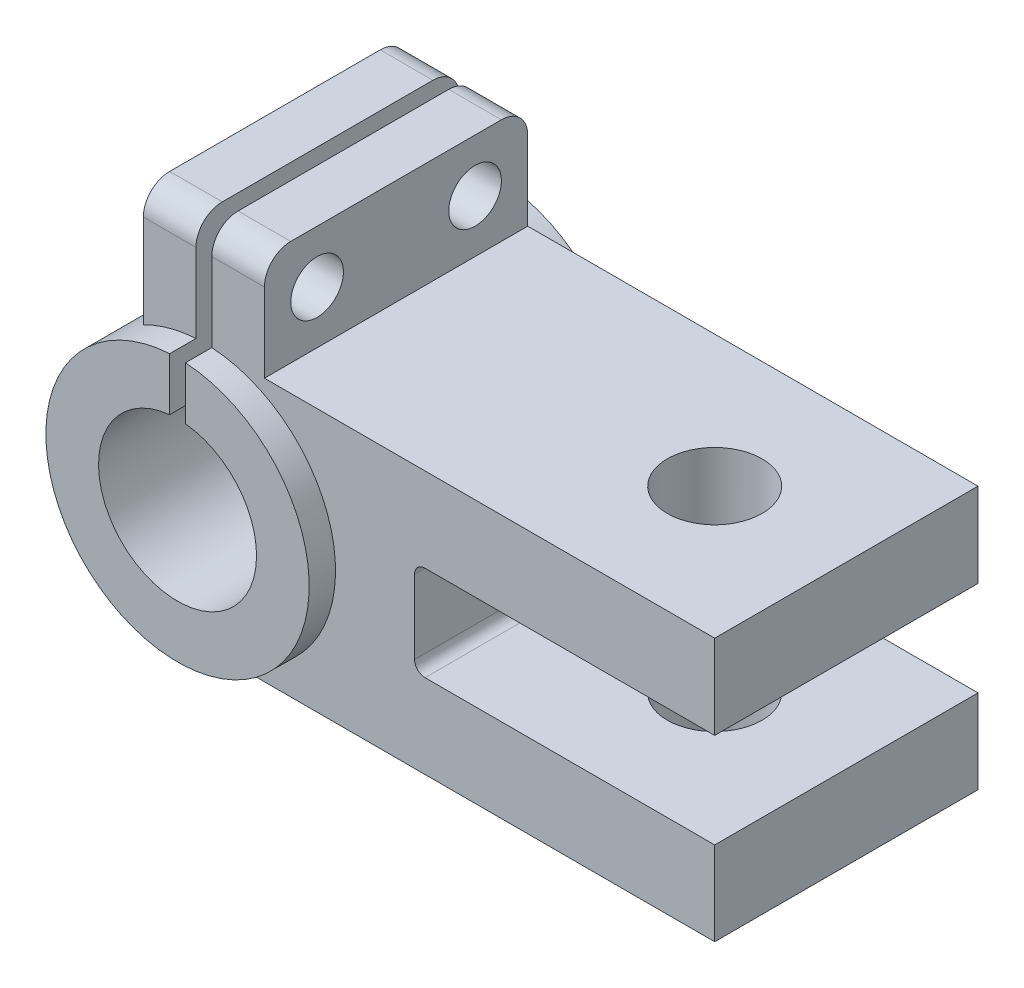
ISO-10303-21;
HEADER;
FILE_DESCRIPTION(('STEP AP214'),'2;1');
FILE_NAME('part.step','',(''),(''),'','','');
FILE_SCHEMA(('AUTOMOTIVE_DESIGN { 1 0 10303 214 1 1 1 1 }'));
ENDSEC;
DATA;
#1=APPLICATION_CONTEXT('core data for automotive mechanical design processes');
#2=APPLICATION_PROTOCOL_DEFINITION('international standard','automotive_design',2000,#1);
#3=PRODUCT_CONTEXT('',#1,'mechanical');
#4=PRODUCT('Part','Part','',(#3));
#5=PRODUCT_RELATED_PRODUCT_CATEGORY('part','',(#4));
#6=PRODUCT_DEFINITION_FORMATION('','',#4);
#7=PRODUCT_DEFINITION_CONTEXT('part definition',#1,'design');
#8=PRODUCT_DEFINITION('design','',#6,#7);
#9=PRODUCT_DEFINITION_SHAPE('','',#8);
#10=(LENGTH_UNIT() NAMED_UNIT(*) SI_UNIT(.MILLI.,.METRE.));
#11=(NAMED_UNIT(*) PLANE_ANGLE_UNIT() SI_UNIT($,.RADIAN.));
#12=(NAMED_UNIT(*) SI_UNIT($,.STERADIAN.) SOLID_ANGLE_UNIT());
#13=UNCERTAINTY_MEASURE_WITH_UNIT(LENGTH_MEASURE(1.E-05),#10,'distance_accuracy_value','');
#14=(GEOMETRIC_REPRESENTATION_CONTEXT(3) GLOBAL_UNCERTAINTY_ASSIGNED_CONTEXT((#13)) GLOBAL_UNIT_ASSIGNED_CONTEXT((#10,
#11,#12)) REPRESENTATION_CONTEXT('',''));
#15=CARTESIAN_POINT('',(0.,0.,0.));
#16=DIRECTION('',(0.,0.,1.));
#17=DIRECTION('',(1.,0.,0.));
#18=AXIS2_PLACEMENT_3D('',#15,#16,#17);
#19=CARTESIAN_POINT('',(0.,0.,30.));
#20=DIRECTION('',(0.,0.,-1.));
#21=DIRECTION('',(-1.,0.,0.));
#22=AXIS2_PLACEMENT_3D('',#19,#20,#21);
#23=CYLINDRICAL_SURFACE('',#22,15.);
#24=CARTESIAN_POINT('',(0.,0.,-30.));
#25=DIRECTION('',(0.,0.,1.));
#26=DIRECTION('',(1.,0.,0.));
#27=AXIS2_PLACEMENT_3D('',#24,#25,#26);
#28=CIRCLE('',#27,15.);
#29=CARTESIAN_POINT('',(-1.5,14.9248115565993,-30.));
#30=VERTEX_POINT('',#29);
#31=CARTESIAN_POINT('',(1.5,14.9248115565993,-30.));
#32=VERTEX_POINT('',#31);
#33=EDGE_CURVE('E358',#30,#32,#28,.T.);
#34=ORIENTED_EDGE('',*,*,#33,.F.);
#35=DIRECTION('',(0.,0.,-1.));
#36=VECTOR('',#35,1.);
#37=CARTESIAN_POINT('',(-1.5,14.9248115565993,30.));
#38=LINE('',#37,#36);
#39=CARTESIAN_POINT('',(-1.5,14.9248115565993,30.));
#40=VERTEX_POINT('',#39);
#41=EDGE_CURVE('E400',#40,#30,#38,.T.);
#42=ORIENTED_EDGE('',*,*,#41,.F.);
#43=CARTESIAN_POINT('',(0.,0.,30.));
#44=DIRECTION('',(0.,0.,1.));
#45=DIRECTION('',(1.,0.,0.));
#46=AXIS2_PLACEMENT_3D('',#43,#44,#45);
#47=CIRCLE('',#46,15.);
#48=CARTESIAN_POINT('',(1.5,14.9248115565993,30.));
#49=VERTEX_POINT('',#48);
#50=EDGE_CURVE('E359',#40,#49,#47,.T.);
#51=ORIENTED_EDGE('',*,*,#50,.T.);
#52=DIRECTION('',(0.,0.,-1.));
#53=VECTOR('',#52,1.);
#54=CARTESIAN_POINT('',(1.5,14.9248115565993,30.));
#55=LINE('',#54,#53);
#56=EDGE_CURVE('E374',#49,#32,#55,.T.);
#57=ORIENTED_EDGE('',*,*,#56,.T.);
#58=EDGE_LOOP('',(#34,#42,#51,#57));
#59=FACE_BOUND('',#58,.T.);
#60=ADVANCED_FACE('F43',(#59),#23,.F.);
#61=CARTESIAN_POINT('',(-1.5,0.,30.));
#62=DIRECTION('',(1.,0.,0.));
#63=DIRECTION('',(0.,1.,0.));
#64=AXIS2_PLACEMENT_3D('',#61,#62,#63);
#65=PLANE('',#64);
#66=CARTESIAN_POINT('',(-1.5,34.9248115565993,-15.));
#67=DIRECTION('',(1.,0.,0.));
#68=DIRECTION('',(0.,1.,0.));
#69=AXIS2_PLACEMENT_3D('',#66,#67,#68);
#70=CIRCLE('',#69,4.99999999999999);
#71=CARTESIAN_POINT('',(-1.5,39.9248115565993,-15.));
#72=VERTEX_POINT('',#71);
#73=EDGE_CURVE('E557',#72,#72,#70,.T.);
#74=ORIENTED_EDGE('',*,*,#73,.F.);
#75=EDGE_LOOP('',(#74));
#76=FACE_BOUND('',#75,.T.);
#77=CARTESIAN_POINT('',(-1.5,34.9248115565993,15.));
#78=DIRECTION('',(1.,0.,0.));
#79=DIRECTION('',(0.,1.,0.));
#80=AXIS2_PLACEMENT_3D('',#77,#78,#79);
#81=CIRCLE('',#80,4.99999999999999);
#82=CARTESIAN_POINT('',(-1.5,39.9248115565993,15.));
#83=VERTEX_POINT('',#82);
#84=EDGE_CURVE('E545',#83,#83,#81,.T.);
#85=ORIENTED_EDGE('',*,*,#84,.F.);
#86=EDGE_LOOP('',(#85));
#87=FACE_BOUND('',#86,.T.);
#88=DIRECTION('',(0.,0.,-1.));
#89=VECTOR('',#88,1.);
#90=CARTESIAN_POINT('',(-1.5,44.9248115565993,25.));
#91=LINE('',#90,#89);
#92=CARTESIAN_POINT('',(-1.5,44.9248115565993,20.));
#93=VERTEX_POINT('',#92);
#94=CARTESIAN_POINT('',(-1.5,44.9248115565993,-20.));
#95=VERTEX_POINT('',#94);
#96=EDGE_CURVE('E252',#93,#95,#91,.T.);
#97=ORIENTED_EDGE('',*,*,#96,.F.);
#98=CARTESIAN_POINT('',(-1.5,39.9248115565993,20.));
#99=DIRECTION('',(1.,0.,0.));
#100=DIRECTION('',(0.,1.,0.));
#101=AXIS2_PLACEMENT_3D('',#98,#99,#100);
#102=CIRCLE('',#101,5.);
#103=CARTESIAN_POINT('',(-1.5,39.9248115565993,25.));
#104=VERTEX_POINT('',#103);
#105=EDGE_CURVE('E419',#93,#104,#102,.T.);
#106=ORIENTED_EDGE('',*,*,#105,.T.);
#107=DIRECTION('',(0.,-1.,0.));
#108=VECTOR('',#107,1.);
#109=CARTESIAN_POINT('',(-1.5,0.,25.));
#110=LINE('',#109,#108);
#111=CARTESIAN_POINT('',(-1.5,24.9549594269356,25.));
#112=VERTEX_POINT('',#111);
#113=EDGE_CURVE('E246',#104,#112,#110,.T.);
#114=ORIENTED_EDGE('',*,*,#113,.T.);
#115=DIRECTION('',(0.,0.,-1.));
#116=VECTOR('',#115,1.);
#117=CARTESIAN_POINT('',(-1.5,24.9549594269356,30.));
#118=LINE('',#117,#116);
#119=CARTESIAN_POINT('',(-1.5,24.9549594269356,30.));
#120=VERTEX_POINT('',#119);
#121=EDGE_CURVE('E397',#120,#112,#118,.T.);
#122=ORIENTED_EDGE('',*,*,#121,.F.);
#123=DIRECTION('',(0.,-1.,0.));
#124=VECTOR('',#123,1.);
#125=CARTESIAN_POINT('',(-1.5,0.,30.));
#126=LINE('',#125,#124);
#127=EDGE_CURVE('E363',#120,#40,#126,.T.);
#128=ORIENTED_EDGE('',*,*,#127,.T.);
#129=ORIENTED_EDGE('',*,*,#41,.T.);
#130=DIRECTION('',(0.,-1.,0.));
#131=VECTOR('',#130,1.);
#132=CARTESIAN_POINT('',(-1.5,0.,-30.));
#133=LINE('',#132,#131);
#134=CARTESIAN_POINT('',(-1.5,24.9549594269356,-30.));
#135=VERTEX_POINT('',#134);
#136=EDGE_CURVE('E378',#135,#30,#133,.T.);
#137=ORIENTED_EDGE('',*,*,#136,.F.);
#138=CARTESIAN_POINT('',(-1.5,24.9549594269356,-25.));
#139=VERTEX_POINT('',#138);
#140=EDGE_CURVE('E396',#139,#135,#118,.T.);
#141=ORIENTED_EDGE('',*,*,#140,.F.);
#142=DIRECTION('',(0.,-1.,0.));
#143=VECTOR('',#142,1.);
#144=CARTESIAN_POINT('',(-1.5,0.,-25.));
#145=LINE('',#144,#143);
#146=CARTESIAN_POINT('',(-1.5,39.9248115565993,-25.));
#147=VERTEX_POINT('',#146);
#148=EDGE_CURVE('E234',#147,#139,#145,.T.);
#149=ORIENTED_EDGE('',*,*,#148,.F.);
#150=CARTESIAN_POINT('',(-1.5,39.9248115565993,-20.));
#151=DIRECTION('',(1.,0.,0.));
#152=DIRECTION('',(0.,1.,0.));
#153=AXIS2_PLACEMENT_3D('',#150,#151,#152);
#154=CIRCLE('',#153,5.);
#155=EDGE_CURVE('E416',#147,#95,#154,.T.);
#156=ORIENTED_EDGE('',*,*,#155,.T.);
#157=EDGE_LOOP('',(#97,#106,#114,#122,#128,#129,#137,#141,#149,#156));
#158=FACE_BOUND('',#157,.T.);
#159=ADVANCED_FACE('F599',(#76,#87,#158),#65,.T.);
#160=CARTESIAN_POINT('',(0.,0.,30.));
#161=DIRECTION('',(0.,0.,-1.));
#162=DIRECTION('',(-1.,0.,0.));
#163=AXIS2_PLACEMENT_3D('',#160,#161,#162);
#164=CYLINDRICAL_SURFACE('',#163,25.);
#165=ORIENTED_EDGE('',*,*,#121,.T.);
#166=CARTESIAN_POINT('',(0.,0.,25.));
#167=DIRECTION('',(0.,0.,1.));
#168=DIRECTION('',(1.,0.,0.));
#169=AXIS2_PLACEMENT_3D('',#166,#167,#168);
#170=CIRCLE('',#169,25.);
#171=CARTESIAN_POINT('',(-11.5,22.1979728804231,25.));
#172=VERTEX_POINT('',#171);
#173=EDGE_CURVE('E218',#112,#172,#170,.T.);
#174=ORIENTED_EDGE('',*,*,#173,.T.);
#175=DIRECTION('',(0.,0.,-1.));
#176=VECTOR('',#175,1.);
#177=CARTESIAN_POINT('',(-11.5,22.1979728804231,25.));
#178=LINE('',#177,#176);
#179=CARTESIAN_POINT('',(-11.5,22.1979728804231,-25.));
#180=VERTEX_POINT('',#179);
#181=EDGE_CURVE('E211',#172,#180,#178,.T.);
#182=ORIENTED_EDGE('',*,*,#181,.T.);
#183=CARTESIAN_POINT('',(0.,0.,-25.));
#184=DIRECTION('',(0.,0.,1.));
#185=DIRECTION('',(1.,0.,0.));
#186=AXIS2_PLACEMENT_3D('',#183,#184,#185);
#187=CIRCLE('',#186,25.);
#188=EDGE_CURVE('E215',#139,#180,#187,.T.);
#189=ORIENTED_EDGE('',*,*,#188,.F.);
#190=ORIENTED_EDGE('',*,*,#140,.T.);
#191=CARTESIAN_POINT('',(0.,0.,-30.));
#192=DIRECTION('',(0.,0.,1.));
#193=DIRECTION('',(1.,0.,0.));
#194=AXIS2_PLACEMENT_3D('',#191,#192,#193);
#195=CIRCLE('',#194,25.);
#196=CARTESIAN_POINT('',(1.5,24.9549594269356,-30.));
#197=VERTEX_POINT('',#196);
#198=EDGE_CURVE('E382',#135,#197,#195,.T.);
#199=ORIENTED_EDGE('',*,*,#198,.T.);
#200=DIRECTION('',(0.,0.,-1.));
#201=VECTOR('',#200,1.);
#202=CARTESIAN_POINT('',(1.5,24.9549594269356,30.));
#203=LINE('',#202,#201);
#204=CARTESIAN_POINT('',(1.5,24.9549594269356,-25.));
#205=VERTEX_POINT('',#204);
#206=EDGE_CURVE('E391',#205,#197,#203,.T.);
#207=ORIENTED_EDGE('',*,*,#206,.F.);
#208=CARTESIAN_POINT('',(0.,0.,-25.));
#209=DIRECTION('',(0.,0.,1.));
#210=DIRECTION('',(1.,0.,0.));
#211=AXIS2_PLACEMENT_3D('',#208,#209,#210);
#212=CIRCLE('',#211,25.);
#213=CARTESIAN_POINT('',(0.,-25.,-25.));
#214=VERTEX_POINT('',#213);
#215=EDGE_CURVE('E256',#214,#205,#212,.T.);
#216=ORIENTED_EDGE('',*,*,#215,.F.);
#217=DIRECTION('',(0.,0.,-1.));
#218=VECTOR('',#217,1.);
#219=CARTESIAN_POINT('',(0.,-25.,25.));
#220=LINE('',#219,#218);
#221=CARTESIAN_POINT('',(0.,-25.,25.));
#222=VERTEX_POINT('',#221);
#223=EDGE_CURVE('E355',#222,#214,#220,.T.);
#224=ORIENTED_EDGE('',*,*,#223,.F.);
#225=CARTESIAN_POINT('',(0.,0.,25.));
#226=DIRECTION('',(0.,0.,1.));
#227=DIRECTION('',(1.,0.,0.));
#228=AXIS2_PLACEMENT_3D('',#225,#226,#227);
#229=CIRCLE('',#228,25.);
#230=CARTESIAN_POINT('',(1.5,24.9549594269356,25.));
#231=VERTEX_POINT('',#230);
#232=EDGE_CURVE('E257',#222,#231,#229,.T.);
#233=ORIENTED_EDGE('',*,*,#232,.T.);
#234=CARTESIAN_POINT('',(1.5,24.9549594269356,30.));
#235=VERTEX_POINT('',#234);
#236=EDGE_CURVE('E392',#235,#231,#203,.T.);
#237=ORIENTED_EDGE('',*,*,#236,.F.);
#238=CARTESIAN_POINT('',(0.,0.,30.));
#239=DIRECTION('',(0.,0.,1.));
#240=DIRECTION('',(1.,0.,0.));
#241=AXIS2_PLACEMENT_3D('',#238,#239,#240);
#242=CIRCLE('',#241,25.);
#243=EDGE_CURVE('E368',#120,#235,#242,.T.);
#244=ORIENTED_EDGE('',*,*,#243,.F.);
#245=EDGE_LOOP('',(#165,#174,#182,#189,#190,#199,#207,#216,#224,#233,#237,#244));
#246=FACE_BOUND('',#245,.T.);
#247=ADVANCED_FACE('F214',(#246),#164,.T.);
#248=CARTESIAN_POINT('',(1.5,0.,30.));
#249=DIRECTION('',(1.,0.,0.));
#250=DIRECTION('',(0.,1.,0.));
#251=AXIS2_PLACEMENT_3D('',#248,#249,#250);
#252=PLANE('',#251);
#253=CARTESIAN_POINT('',(1.5,34.9248115565993,-15.));
#254=DIRECTION('',(1.,0.,0.));
#255=DIRECTION('',(0.,1.,0.));
#256=AXIS2_PLACEMENT_3D('',#253,#254,#255);
#257=CIRCLE('',#256,4.99999999999999);
#258=CARTESIAN_POINT('',(1.5,39.9248115565993,-15.));
#259=VERTEX_POINT('',#258);
#260=EDGE_CURVE('E565',#259,#259,#257,.T.);
#261=ORIENTED_EDGE('',*,*,#260,.T.);
#262=EDGE_LOOP('',(#261));
#263=FACE_BOUND('',#262,.T.);
#264=CARTESIAN_POINT('',(1.5,34.9248115565993,15.));
#265=DIRECTION('',(1.,0.,0.));
#266=DIRECTION('',(0.,1.,0.));
#267=AXIS2_PLACEMENT_3D('',#264,#265,#266);
#268=CIRCLE('',#267,4.99999999999999);
#269=CARTESIAN_POINT('',(1.5,39.9248115565993,15.));
#270=VERTEX_POINT('',#269);
#271=EDGE_CURVE('E549',#270,#270,#268,.T.);
#272=ORIENTED_EDGE('',*,*,#271,.T.);
#273=EDGE_LOOP('',(#272));
#274=FACE_BOUND('',#273,.T.);
#275=DIRECTION('',(0.,-1.,0.));
#276=VECTOR('',#275,1.);
#277=CARTESIAN_POINT('',(1.5,0.,25.));
#278=LINE('',#277,#276);
#279=CARTESIAN_POINT('',(1.5,39.9248115565993,25.));
#280=VERTEX_POINT('',#279);
#281=EDGE_CURVE('E292',#280,#231,#278,.T.);
#282=ORIENTED_EDGE('',*,*,#281,.F.);
#283=CARTESIAN_POINT('',(1.5,39.9248115565993,20.));
#284=DIRECTION('',(1.,0.,0.));
#285=DIRECTION('',(0.,1.,0.));
#286=AXIS2_PLACEMENT_3D('',#283,#284,#285);
#287=CIRCLE('',#286,5.);
#288=CARTESIAN_POINT('',(1.5,44.9248115565993,20.));
#289=VERTEX_POINT('',#288);
#290=EDGE_CURVE('E437',#280,#289,#287,.F.);
#291=ORIENTED_EDGE('',*,*,#290,.T.);
#292=DIRECTION('',(0.,0.,-1.));
#293=VECTOR('',#292,1.);
#294=CARTESIAN_POINT('',(1.5,44.9248115565993,25.));
#295=LINE('',#294,#293);
#296=CARTESIAN_POINT('',(1.5,44.9248115565993,-20.));
#297=VERTEX_POINT('',#296);
#298=EDGE_CURVE('E295',#289,#297,#295,.T.);
#299=ORIENTED_EDGE('',*,*,#298,.T.);
#300=CARTESIAN_POINT('',(1.5,39.9248115565993,-20.));
#301=DIRECTION('',(1.,0.,0.));
#302=DIRECTION('',(0.,1.,0.));
#303=AXIS2_PLACEMENT_3D('',#300,#301,#302);
#304=CIRCLE('',#303,5.);
#305=CARTESIAN_POINT('',(1.5,39.9248115565993,-25.));
#306=VERTEX_POINT('',#305);
#307=EDGE_CURVE('E434',#297,#306,#304,.F.);
#308=ORIENTED_EDGE('',*,*,#307,.T.);
#309=DIRECTION('',(0.,-1.,0.));
#310=VECTOR('',#309,1.);
#311=CARTESIAN_POINT('',(1.5,0.,-25.));
#312=LINE('',#311,#310);
#313=EDGE_CURVE('E262',#306,#205,#312,.T.);
#314=ORIENTED_EDGE('',*,*,#313,.T.);
#315=ORIENTED_EDGE('',*,*,#206,.T.);
#316=DIRECTION('',(0.,-1.,0.));
#317=VECTOR('',#316,1.);
#318=CARTESIAN_POINT('',(1.5,0.,-30.));
#319=LINE('',#318,#317);
#320=EDGE_CURVE('E364',#197,#32,#319,.T.);
#321=ORIENTED_EDGE('',*,*,#320,.T.);
#322=ORIENTED_EDGE('',*,*,#56,.F.);
#323=DIRECTION('',(0.,-1.,0.));
#324=VECTOR('',#323,1.);
#325=CARTESIAN_POINT('',(1.5,0.,30.));
#326=LINE('',#325,#324);
#327=EDGE_CURVE('E371',#235,#49,#326,.T.);
#328=ORIENTED_EDGE('',*,*,#327,.F.);
#329=ORIENTED_EDGE('',*,*,#236,.T.);
#330=EDGE_LOOP('',(#282,#291,#299,#308,#314,#315,#321,#322,#328,#329));
#331=FACE_BOUND('',#330,.T.);
#332=ADVANCED_FACE('F507',(#263,#274,#331),#252,.F.);
#333=CARTESIAN_POINT('',(0.,0.,30.));
#334=DIRECTION('',(0.,0.,1.));
#335=DIRECTION('',(1.,0.,0.));
#336=AXIS2_PLACEMENT_3D('',#333,#334,#335);
#337=PLANE('',#336);
#338=ORIENTED_EDGE('',*,*,#50,.F.);
#339=ORIENTED_EDGE('',*,*,#127,.F.);
#340=ORIENTED_EDGE('',*,*,#243,.T.);
#341=ORIENTED_EDGE('',*,*,#327,.T.);
#342=EDGE_LOOP('',(#338,#339,#340,#341));
#343=FACE_BOUND('',#342,.T.);
#344=ADVANCED_FACE('F648',(#343),#337,.T.);
#345=CARTESIAN_POINT('',(0.,0.,-30.));
#346=DIRECTION('',(0.,0.,1.));
#347=DIRECTION('',(1.,0.,0.));
#348=AXIS2_PLACEMENT_3D('',#345,#346,#347);
#349=PLANE('',#348);
#350=ORIENTED_EDGE('',*,*,#33,.T.);
#351=ORIENTED_EDGE('',*,*,#320,.F.);
#352=ORIENTED_EDGE('',*,*,#198,.F.);
#353=ORIENTED_EDGE('',*,*,#136,.T.);
#354=EDGE_LOOP('',(#350,#351,#352,#353));
#355=FACE_BOUND('',#354,.T.);
#356=ADVANCED_FACE('F660',(#355),#349,.F.);
#357=CARTESIAN_POINT('',(0.,-25.,25.));
#358=DIRECTION('',(0.,-1.,0.));
#359=DIRECTION('',(1.,0.,0.));
#360=AXIS2_PLACEMENT_3D('',#357,#358,#359);
#361=PLANE('',#360);
#362=CARTESIAN_POINT('',(72.,-25.,0.));
#363=DIRECTION('',(0.,-1.,0.));
#364=DIRECTION('',(0.,0.,-1.));
#365=AXIS2_PLACEMENT_3D('',#362,#363,#364);
#366=CIRCLE('',#365,8.99999999999999);
#367=CARTESIAN_POINT('',(72.,-25.,-8.99999999999999));
#368=VERTEX_POINT('',#367);
#369=EDGE_CURVE('E409',#368,#368,#366,.T.);
#370=ORIENTED_EDGE('',*,*,#369,.F.);
#371=EDGE_LOOP('',(#370));
#372=FACE_BOUND('',#371,.T.);
#373=DIRECTION('',(-1.,0.,0.));
#374=VECTOR('',#373,1.);
#375=CARTESIAN_POINT('',(0.,-25.,-25.));
#376=LINE('',#375,#374);
#377=CARTESIAN_POINT('',(97.,-25.,-25.));
#378=VERTEX_POINT('',#377);
#379=EDGE_CURVE('E299',#378,#214,#376,.T.);
#380=ORIENTED_EDGE('',*,*,#379,.F.);
#381=DIRECTION('',(0.,0.,-1.));
#382=VECTOR('',#381,1.);
#383=CARTESIAN_POINT('',(97.,-25.,25.));
#384=LINE('',#383,#382);
#385=CARTESIAN_POINT('',(97.,-25.,25.));
#386=VERTEX_POINT('',#385);
#387=EDGE_CURVE('E352',#386,#378,#384,.T.);
#388=ORIENTED_EDGE('',*,*,#387,.F.);
#389=DIRECTION('',(-1.,0.,0.));
#390=VECTOR('',#389,1.);
#391=CARTESIAN_POINT('',(0.,-25.,25.));
#392=LINE('',#391,#390);
#393=EDGE_CURVE('E261',#386,#222,#392,.T.);
#394=ORIENTED_EDGE('',*,*,#393,.T.);
#395=ORIENTED_EDGE('',*,*,#223,.T.);
#396=EDGE_LOOP('',(#380,#388,#394,#395));
#397=FACE_BOUND('',#396,.T.);
#398=ADVANCED_FACE('F641',(#372,#397),#361,.T.);
#399=CARTESIAN_POINT('',(97.,0.,25.));
#400=DIRECTION('',(1.,0.,0.));
#401=DIRECTION('',(0.,0.,-1.));
#402=AXIS2_PLACEMENT_3D('',#399,#400,#401);
#403=PLANE('',#402);
#404=DIRECTION('',(0.,-1.,0.));
#405=VECTOR('',#404,1.);
#406=CARTESIAN_POINT('',(97.,0.,-25.));
#407=LINE('',#406,#405);
#408=CARTESIAN_POINT('',(97.,-9.07518844340071,-25.));
#409=VERTEX_POINT('',#408);
#410=EDGE_CURVE('E303',#409,#378,#407,.T.);
#411=ORIENTED_EDGE('',*,*,#410,.F.);
#412=DIRECTION('',(0.,0.,-1.));
#413=VECTOR('',#412,1.);
#414=CARTESIAN_POINT('',(97.,-9.07518844340071,25.));
#415=LINE('',#414,#413);
#416=CARTESIAN_POINT('',(97.,-9.07518844340071,25.));
#417=VERTEX_POINT('',#416);
#418=EDGE_CURVE('E348',#417,#409,#415,.T.);
#419=ORIENTED_EDGE('',*,*,#418,.F.);
#420=DIRECTION('',(0.,-1.,0.));
#421=VECTOR('',#420,1.);
#422=CARTESIAN_POINT('',(97.,0.,25.));
#423=LINE('',#422,#421);
#424=EDGE_CURVE('E266',#417,#386,#423,.T.);
#425=ORIENTED_EDGE('',*,*,#424,.T.);
#426=ORIENTED_EDGE('',*,*,#387,.T.);
#427=EDGE_LOOP('',(#411,#419,#425,#426));
#428=FACE_BOUND('',#427,.T.);
#429=ADVANCED_FACE('F639',(#428),#403,.T.);
#430=CARTESIAN_POINT('',(0.,-9.07518844340071,25.));
#431=DIRECTION('',(0.,1.,0.));
#432=DIRECTION('',(0.,0.,1.));
#433=AXIS2_PLACEMENT_3D('',#430,#431,#432);
#434=PLANE('',#433);
#435=CARTESIAN_POINT('',(72.,-9.07518844340071,0.));
#436=DIRECTION('',(0.,1.,0.));
#437=DIRECTION('',(0.,0.,1.));
#438=AXIS2_PLACEMENT_3D('',#435,#436,#437);
#439=CIRCLE('',#438,8.99999999999999);
#440=CARTESIAN_POINT('',(72.,-9.07518844340071,8.99999999999999));
#441=VERTEX_POINT('',#440);
#442=EDGE_CURVE('E236',#441,#441,#439,.T.);
#443=ORIENTED_EDGE('',*,*,#442,.F.);
#444=EDGE_LOOP('',(#443));
#445=FACE_BOUND('',#444,.T.);
#446=DIRECTION('',(1.,0.,0.));
#447=VECTOR('',#446,1.);
#448=CARTESIAN_POINT('',(0.,-9.07518844340071,-25.));
#449=LINE('',#448,#447);
#450=CARTESIAN_POINT('',(42.,-9.07518844340071,-25.));
#451=VERTEX_POINT('',#450);
#452=EDGE_CURVE('E307',#451,#409,#449,.T.);
#453=ORIENTED_EDGE('',*,*,#452,.F.);
#454=DIRECTION('',(0.,0.,-1.));
#455=VECTOR('',#454,1.);
#456=CARTESIAN_POINT('',(42.,-9.07518844340071,25.));
#457=LINE('',#456,#455);
#458=CARTESIAN_POINT('',(42.,-9.07518844340071,25.));
#459=VERTEX_POINT('',#458);
#460=EDGE_CURVE('E466',#451,#459,#457,.F.);
#461=ORIENTED_EDGE('',*,*,#460,.T.);
#462=DIRECTION('',(1.,0.,0.));
#463=VECTOR('',#462,1.);
#464=CARTESIAN_POINT('',(0.,-9.07518844340071,25.));
#465=LINE('',#464,#463);
#466=EDGE_CURVE('E270',#459,#417,#465,.T.);
#467=ORIENTED_EDGE('',*,*,#466,.T.);
#468=ORIENTED_EDGE('',*,*,#418,.T.);
#469=EDGE_LOOP('',(#453,#461,#467,#468));
#470=FACE_BOUND('',#469,.T.);
#471=ADVANCED_FACE('F636',(#445,#470),#434,.T.);
#472=CARTESIAN_POINT('',(40.,0.,25.));
#473=DIRECTION('',(1.,0.,0.));
#474=DIRECTION('',(0.,0.,-1.));
#475=AXIS2_PLACEMENT_3D('',#472,#473,#474);
#476=PLANE('',#475);
#477=DIRECTION('',(0.,-1.,0.));
#478=VECTOR('',#477,1.);
#479=CARTESIAN_POINT('',(40.,0.,25.));
#480=LINE('',#479,#478);
#481=CARTESIAN_POINT('',(40.,6.92481155659929,25.));
#482=VERTEX_POINT('',#481);
#483=CARTESIAN_POINT('',(40.,-7.07518844340071,25.));
#484=VERTEX_POINT('',#483);
#485=EDGE_CURVE('E273',#482,#484,#480,.T.);
#486=ORIENTED_EDGE('',*,*,#485,.T.);
#487=DIRECTION('',(0.,0.,-1.));
#488=VECTOR('',#487,1.);
#489=CARTESIAN_POINT('',(40.,-7.07518844340071,-25.));
#490=LINE('',#489,#488);
#491=CARTESIAN_POINT('',(40.,-7.07518844340071,-25.));
#492=VERTEX_POINT('',#491);
#493=EDGE_CURVE('E462',#484,#492,#490,.T.);
#494=ORIENTED_EDGE('',*,*,#493,.T.);
#495=DIRECTION('',(0.,-1.,0.));
#496=VECTOR('',#495,1.);
#497=CARTESIAN_POINT('',(40.,0.,-25.));
#498=LINE('',#497,#496);
#499=CARTESIAN_POINT('',(40.,6.92481155659929,-25.));
#500=VERTEX_POINT('',#499);
#501=EDGE_CURVE('E310',#500,#492,#498,.T.);
#502=ORIENTED_EDGE('',*,*,#501,.F.);
#503=DIRECTION('',(0.,0.,-1.));
#504=VECTOR('',#503,1.);
#505=CARTESIAN_POINT('',(40.,6.92481155659929,25.));
#506=LINE('',#505,#504);
#507=EDGE_CURVE('E459',#500,#482,#506,.F.);
#508=ORIENTED_EDGE('',*,*,#507,.T.);
#509=EDGE_LOOP('',(#486,#494,#502,#508));
#510=FACE_BOUND('',#509,.T.);
#511=ADVANCED_FACE('F484',(#510),#476,.T.);
#512=CARTESIAN_POINT('',(0.,8.92481155659928,25.));
#513=DIRECTION('',(0.,-1.,0.));
#514=DIRECTION('',(1.,0.,0.));
#515=AXIS2_PLACEMENT_3D('',#512,#513,#514);
#516=PLANE('',#515);
#517=CARTESIAN_POINT('',(72.,8.92481155659929,0.));
#518=DIRECTION('',(0.,-1.,0.));
#519=DIRECTION('',(1.,0.,0.));
#520=AXIS2_PLACEMENT_3D('',#517,#518,#519);
#521=CIRCLE('',#520,8.99999999999999);
#522=CARTESIAN_POINT('',(81.,8.92481155659929,0.));
#523=VERTEX_POINT('',#522);
#524=EDGE_CURVE('E408',#523,#523,#521,.T.);
#525=ORIENTED_EDGE('',*,*,#524,.F.);
#526=EDGE_LOOP('',(#525));
#527=FACE_BOUND('',#526,.T.);
#528=DIRECTION('',(-1.,0.,0.));
#529=VECTOR('',#528,1.);
#530=CARTESIAN_POINT('',(0.,8.92481155659928,25.));
#531=LINE('',#530,#529);
#532=CARTESIAN_POINT('',(97.,8.9248115565993,25.));
#533=VERTEX_POINT('',#532);
#534=CARTESIAN_POINT('',(42.,8.92481155659929,25.));
#535=VERTEX_POINT('',#534);
#536=EDGE_CURVE('E277',#533,#535,#531,.T.);
#537=ORIENTED_EDGE('',*,*,#536,.T.);
#538=DIRECTION('',(0.,0.,-1.));
#539=VECTOR('',#538,1.);
#540=CARTESIAN_POINT('',(42.,8.92481155659929,-25.));
#541=LINE('',#540,#539);
#542=CARTESIAN_POINT('',(42.,8.92481155659929,-25.));
#543=VERTEX_POINT('',#542);
#544=EDGE_CURVE('E469',#535,#543,#541,.T.);
#545=ORIENTED_EDGE('',*,*,#544,.T.);
#546=DIRECTION('',(-1.,0.,0.));
#547=VECTOR('',#546,1.);
#548=CARTESIAN_POINT('',(0.,8.92481155659928,-25.));
#549=LINE('',#548,#547);
#550=CARTESIAN_POINT('',(97.,8.9248115565993,-25.));
#551=VERTEX_POINT('',#550);
#552=EDGE_CURVE('E314',#551,#543,#549,.T.);
#553=ORIENTED_EDGE('',*,*,#552,.F.);
#554=DIRECTION('',(0.,0.,-1.));
#555=VECTOR('',#554,1.);
#556=CARTESIAN_POINT('',(97.,8.9248115565993,25.));
#557=LINE('',#556,#555);
#558=EDGE_CURVE('E345',#533,#551,#557,.T.);
#559=ORIENTED_EDGE('',*,*,#558,.F.);
#560=EDGE_LOOP('',(#537,#545,#553,#559));
#561=FACE_BOUND('',#560,.T.);
#562=ADVANCED_FACE('F487',(#527,#561),#516,.T.);
#563=CARTESIAN_POINT('',(97.,0.,25.));
#564=DIRECTION('',(1.,0.,0.));
#565=DIRECTION('',(0.,0.,-1.));
#566=AXIS2_PLACEMENT_3D('',#563,#564,#565);
#567=PLANE('',#566);
#568=DIRECTION('',(0.,-1.,0.));
#569=VECTOR('',#568,1.);
#570=CARTESIAN_POINT('',(97.,0.,-25.));
#571=LINE('',#570,#569);
#572=CARTESIAN_POINT('',(97.,24.9248115565993,-25.));
#573=VERTEX_POINT('',#572);
#574=EDGE_CURVE('E318',#573,#551,#571,.T.);
#575=ORIENTED_EDGE('',*,*,#574,.F.);
#576=DIRECTION('',(0.,0.,-1.));
#577=VECTOR('',#576,1.);
#578=CARTESIAN_POINT('',(97.,24.9248115565993,25.));
#579=LINE('',#578,#577);
#580=CARTESIAN_POINT('',(97.,24.9248115565993,25.));
#581=VERTEX_POINT('',#580);
#582=EDGE_CURVE('E342',#581,#573,#579,.T.);
#583=ORIENTED_EDGE('',*,*,#582,.F.);
#584=DIRECTION('',(0.,-1.,0.));
#585=VECTOR('',#584,1.);
#586=CARTESIAN_POINT('',(97.,0.,25.));
#587=LINE('',#586,#585);
#588=EDGE_CURVE('E280',#581,#533,#587,.T.);
#589=ORIENTED_EDGE('',*,*,#588,.T.);
#590=ORIENTED_EDGE('',*,*,#558,.T.);
#591=EDGE_LOOP('',(#575,#583,#589,#590));
#592=FACE_BOUND('',#591,.T.);
#593=ADVANCED_FACE('F493',(#592),#567,.T.);
#594=CARTESIAN_POINT('',(0.,24.9248115565993,25.));
#595=DIRECTION('',(0.,1.,0.));
#596=DIRECTION('',(0.,0.,1.));
#597=AXIS2_PLACEMENT_3D('',#594,#595,#596);
#598=PLANE('',#597);
#599=CARTESIAN_POINT('',(72.,24.9248115565993,0.));
#600=DIRECTION('',(0.,1.,0.));
#601=DIRECTION('',(0.,0.,1.));
#602=AXIS2_PLACEMENT_3D('',#599,#600,#601);
#603=CIRCLE('',#602,8.99999999999999);
#604=CARTESIAN_POINT('',(72.,24.9248115565993,8.99999999999999));
#605=VERTEX_POINT('',#604);
#606=EDGE_CURVE('E404',#605,#605,#603,.T.);
#607=ORIENTED_EDGE('',*,*,#606,.F.);
#608=EDGE_LOOP('',(#607));
#609=FACE_BOUND('',#608,.T.);
#610=DIRECTION('',(1.,0.,0.));
#611=VECTOR('',#610,1.);
#612=CARTESIAN_POINT('',(0.,24.9248115565993,-25.));
#613=LINE('',#612,#611);
#614=CARTESIAN_POINT('',(11.5,24.9248115565993,-25.));
#615=VERTEX_POINT('',#614);
#616=EDGE_CURVE('E322',#615,#573,#613,.T.);
#617=ORIENTED_EDGE('',*,*,#616,.F.);
#618=DIRECTION('',(0.,0.,-1.));
#619=VECTOR('',#618,1.);
#620=CARTESIAN_POINT('',(11.5,24.9248115565993,25.));
#621=LINE('',#620,#619);
#622=CARTESIAN_POINT('',(11.5,24.9248115565993,25.));
#623=VERTEX_POINT('',#622);
#624=EDGE_CURVE('E339',#623,#615,#621,.T.);
#625=ORIENTED_EDGE('',*,*,#624,.F.);
#626=DIRECTION('',(1.,0.,0.));
#627=VECTOR('',#626,1.);
#628=CARTESIAN_POINT('',(0.,24.9248115565993,25.));
#629=LINE('',#628,#627);
#630=EDGE_CURVE('E284',#623,#581,#629,.T.);
#631=ORIENTED_EDGE('',*,*,#630,.T.);
#632=ORIENTED_EDGE('',*,*,#582,.T.);
#633=EDGE_LOOP('',(#617,#625,#631,#632));
#634=FACE_BOUND('',#633,.T.);
#635=ADVANCED_FACE('F496',(#609,#634),#598,.T.);
#636=CARTESIAN_POINT('',(11.5,0.,25.));
#637=DIRECTION('',(-1.,0.,0.));
#638=DIRECTION('',(0.,0.,1.));
#639=AXIS2_PLACEMENT_3D('',#636,#637,#638);
#640=PLANE('',#639);
#641=CARTESIAN_POINT('',(11.5,34.9248115565993,-15.));
#642=DIRECTION('',(-1.,0.,0.));
#643=DIRECTION('',(0.,0.,1.));
#644=AXIS2_PLACEMENT_3D('',#641,#642,#643);
#645=CIRCLE('',#644,4.99999999999999);
#646=CARTESIAN_POINT('',(11.5,34.9248115565993,-10.));
#647=VERTEX_POINT('',#646);
#648=EDGE_CURVE('E561',#647,#647,#645,.T.);
#649=ORIENTED_EDGE('',*,*,#648,.T.);
#650=EDGE_LOOP('',(#649));
#651=FACE_BOUND('',#650,.T.);
#652=CARTESIAN_POINT('',(11.5,34.9248115565993,15.));
#653=DIRECTION('',(-1.,0.,0.));
#654=DIRECTION('',(0.,0.,1.));
#655=AXIS2_PLACEMENT_3D('',#652,#653,#654);
#656=CIRCLE('',#655,4.99999999999999);
#657=CARTESIAN_POINT('',(11.5,34.9248115565993,20.));
#658=VERTEX_POINT('',#657);
#659=EDGE_CURVE('E541',#658,#658,#656,.T.);
#660=ORIENTED_EDGE('',*,*,#659,.T.);
#661=EDGE_LOOP('',(#660));
#662=FACE_BOUND('',#661,.T.);
#663=DIRECTION('',(0.,0.,-1.));
#664=VECTOR('',#663,1.);
#665=CARTESIAN_POINT('',(11.5,44.9248115565993,25.));
#666=LINE('',#665,#664);
#667=CARTESIAN_POINT('',(11.5,44.9248115565993,20.));
#668=VERTEX_POINT('',#667);
#669=CARTESIAN_POINT('',(11.5,44.9248115565993,-20.));
#670=VERTEX_POINT('',#669);
#671=EDGE_CURVE('E335',#668,#670,#666,.T.);
#672=ORIENTED_EDGE('',*,*,#671,.F.);
#673=CARTESIAN_POINT('',(11.5,39.9248115565993,20.));
#674=DIRECTION('',(-1.,0.,0.));
#675=DIRECTION('',(0.,0.,1.));
#676=AXIS2_PLACEMENT_3D('',#673,#674,#675);
#677=CIRCLE('',#676,5.);
#678=CARTESIAN_POINT('',(11.5,39.9248115565993,25.));
#679=VERTEX_POINT('',#678);
#680=EDGE_CURVE('E450',#668,#679,#677,.F.);
#681=ORIENTED_EDGE('',*,*,#680,.T.);
#682=DIRECTION('',(0.,1.,0.));
#683=VECTOR('',#682,1.);
#684=CARTESIAN_POINT('',(11.5,0.,25.));
#685=LINE('',#684,#683);
#686=EDGE_CURVE('E288',#623,#679,#685,.T.);
#687=ORIENTED_EDGE('',*,*,#686,.F.);
#688=ORIENTED_EDGE('',*,*,#624,.T.);
#689=DIRECTION('',(0.,1.,0.));
#690=VECTOR('',#689,1.);
#691=CARTESIAN_POINT('',(11.5,0.,-25.));
#692=LINE('',#691,#690);
#693=CARTESIAN_POINT('',(11.5,39.9248115565993,-25.));
#694=VERTEX_POINT('',#693);
#695=EDGE_CURVE('E326',#615,#694,#692,.T.);
#696=ORIENTED_EDGE('',*,*,#695,.T.);
#697=CARTESIAN_POINT('',(11.5,39.9248115565993,-20.));
#698=DIRECTION('',(-1.,0.,0.));
#699=DIRECTION('',(0.,0.,1.));
#700=AXIS2_PLACEMENT_3D('',#697,#698,#699);
#701=CIRCLE('',#700,5.);
#702=EDGE_CURVE('E447',#694,#670,#701,.F.);
#703=ORIENTED_EDGE('',*,*,#702,.T.);
#704=EDGE_LOOP('',(#672,#681,#687,#688,#696,#703));
#705=FACE_BOUND('',#704,.T.);
#706=ADVANCED_FACE('F778',(#651,#662,#705),#640,.F.);
#707=CARTESIAN_POINT('',(0.,44.9248115565993,25.));
#708=DIRECTION('',(0.,-1.,0.));
#709=DIRECTION('',(0.,0.,-1.));
#710=AXIS2_PLACEMENT_3D('',#707,#708,#709);
#711=PLANE('',#710);
#712=ORIENTED_EDGE('',*,*,#298,.F.);
#713=DIRECTION('',(-1.,0.,0.));
#714=VECTOR('',#713,1.);
#715=CARTESIAN_POINT('',(11.5,44.9248115565993,20.));
#716=LINE('',#715,#714);
#717=EDGE_CURVE('E444',#289,#668,#716,.F.);
#718=ORIENTED_EDGE('',*,*,#717,.T.);
#719=ORIENTED_EDGE('',*,*,#671,.T.);
#720=DIRECTION('',(-1.,0.,0.));
#721=VECTOR('',#720,1.);
#722=CARTESIAN_POINT('',(0.,44.9248115565993,-20.));
#723=LINE('',#722,#721);
#724=EDGE_CURVE('E440',#670,#297,#723,.T.);
#725=ORIENTED_EDGE('',*,*,#724,.T.);
#726=EDGE_LOOP('',(#712,#718,#719,#725));
#727=FACE_BOUND('',#726,.T.);
#728=ADVANCED_FACE('F509',(#727),#711,.F.);
#729=CARTESIAN_POINT('',(0.,0.,25.));
#730=DIRECTION('',(0.,0.,1.));
#731=DIRECTION('',(1.,0.,0.));
#732=AXIS2_PLACEMENT_3D('',#729,#730,#731);
#733=PLANE('',#732);
#734=ORIENTED_EDGE('',*,*,#686,.T.);
#735=DIRECTION('',(-1.,0.,0.));
#736=VECTOR('',#735,1.);
#737=CARTESIAN_POINT('',(1.5,39.9248115565993,25.));
#738=LINE('',#737,#736);
#739=EDGE_CURVE('E430',#679,#280,#738,.T.);
#740=ORIENTED_EDGE('',*,*,#739,.T.);
#741=ORIENTED_EDGE('',*,*,#281,.T.);
#742=ORIENTED_EDGE('',*,*,#232,.F.);
#743=ORIENTED_EDGE('',*,*,#393,.F.);
#744=ORIENTED_EDGE('',*,*,#424,.F.);
#745=ORIENTED_EDGE('',*,*,#466,.F.);
#746=CARTESIAN_POINT('',(42.,-7.07518844340071,25.));
#747=DIRECTION('',(0.,0.,1.));
#748=DIRECTION('',(1.,0.,0.));
#749=AXIS2_PLACEMENT_3D('',#746,#747,#748);
#750=CIRCLE('',#749,2.);
#751=EDGE_CURVE('E475',#459,#484,#750,.F.);
#752=ORIENTED_EDGE('',*,*,#751,.T.);
#753=ORIENTED_EDGE('',*,*,#485,.F.);
#754=CARTESIAN_POINT('',(42.,6.92481155659929,25.));
#755=DIRECTION('',(0.,0.,1.));
#756=DIRECTION('',(1.,0.,0.));
#757=AXIS2_PLACEMENT_3D('',#754,#755,#756);
#758=CIRCLE('',#757,2.);
#759=EDGE_CURVE('E11',#482,#535,#758,.F.);
#760=ORIENTED_EDGE('',*,*,#759,.T.);
#761=ORIENTED_EDGE('',*,*,#536,.F.);
#762=ORIENTED_EDGE('',*,*,#588,.F.);
#763=ORIENTED_EDGE('',*,*,#630,.F.);
#764=EDGE_LOOP('',(#734,#740,#741,#742,#743,#744,#745,#752,#753,#760,#761,#762,#763));
#765=FACE_BOUND('',#764,.T.);
#766=ADVANCED_FACE('F489',(#765),#733,.T.);
#767=CARTESIAN_POINT('',(0.,0.,-25.));
#768=DIRECTION('',(0.,0.,1.));
#769=DIRECTION('',(1.,0.,0.));
#770=AXIS2_PLACEMENT_3D('',#767,#768,#769);
#771=PLANE('',#770);
#772=ORIENTED_EDGE('',*,*,#313,.F.);
#773=DIRECTION('',(-1.,0.,0.));
#774=VECTOR('',#773,1.);
#775=CARTESIAN_POINT('',(0.,39.9248115565993,-25.));
#776=LINE('',#775,#774);
#777=EDGE_CURVE('E456',#306,#694,#776,.F.);
#778=ORIENTED_EDGE('',*,*,#777,.T.);
#779=ORIENTED_EDGE('',*,*,#695,.F.);
#780=ORIENTED_EDGE('',*,*,#616,.T.);
#781=ORIENTED_EDGE('',*,*,#574,.T.);
#782=ORIENTED_EDGE('',*,*,#552,.T.);
#783=CARTESIAN_POINT('',(42.,6.92481155659929,-25.));
#784=DIRECTION('',(0.,0.,1.));
#785=DIRECTION('',(1.,0.,0.));
#786=AXIS2_PLACEMENT_3D('',#783,#784,#785);
#787=CIRCLE('',#786,2.);
#788=EDGE_CURVE('E52',#543,#500,#787,.T.);
#789=ORIENTED_EDGE('',*,*,#788,.T.);
#790=ORIENTED_EDGE('',*,*,#501,.T.);
#791=CARTESIAN_POINT('',(42.,-7.07518844340071,-25.));
#792=DIRECTION('',(0.,0.,1.));
#793=DIRECTION('',(1.,0.,0.));
#794=AXIS2_PLACEMENT_3D('',#791,#792,#793);
#795=CIRCLE('',#794,2.);
#796=EDGE_CURVE('E472',#492,#451,#795,.T.);
#797=ORIENTED_EDGE('',*,*,#796,.T.);
#798=ORIENTED_EDGE('',*,*,#452,.T.);
#799=ORIENTED_EDGE('',*,*,#410,.T.);
#800=ORIENTED_EDGE('',*,*,#379,.T.);
#801=ORIENTED_EDGE('',*,*,#215,.T.);
#802=EDGE_LOOP('',(#772,#778,#779,#780,#781,#782,#789,#790,#797,#798,#799,#800,#801));
#803=FACE_BOUND('',#802,.T.);
#804=ADVANCED_FACE('F481',(#803),#771,.F.);
#805=CARTESIAN_POINT('',(0.,44.9248115565993,25.));
#806=DIRECTION('',(0.,1.,0.));
#807=DIRECTION('',(0.,0.,1.));
#808=AXIS2_PLACEMENT_3D('',#805,#806,#807);
#809=PLANE('',#808);
#810=DIRECTION('',(0.,0.,-1.));
#811=VECTOR('',#810,1.);
#812=CARTESIAN_POINT('',(-11.5,44.9248115565993,25.));
#813=LINE('',#812,#811);
#814=CARTESIAN_POINT('',(-11.5,44.9248115565993,20.));
#815=VERTEX_POINT('',#814);
#816=CARTESIAN_POINT('',(-11.5,44.9248115565993,-20.));
#817=VERTEX_POINT('',#816);
#818=EDGE_CURVE('E224',#815,#817,#813,.T.);
#819=ORIENTED_EDGE('',*,*,#818,.F.);
#820=DIRECTION('',(1.,0.,0.));
#821=VECTOR('',#820,1.);
#822=CARTESIAN_POINT('',(0.,44.9248115565993,20.));
#823=LINE('',#822,#821);
#824=EDGE_CURVE('E412',#815,#93,#823,.T.);
#825=ORIENTED_EDGE('',*,*,#824,.T.);
#826=ORIENTED_EDGE('',*,*,#96,.T.);
#827=DIRECTION('',(1.,0.,0.));
#828=VECTOR('',#827,1.);
#829=CARTESIAN_POINT('',(-11.5,44.9248115565993,-20.));
#830=LINE('',#829,#828);
#831=EDGE_CURVE('E403',#95,#817,#830,.F.);
#832=ORIENTED_EDGE('',*,*,#831,.T.);
#833=EDGE_LOOP('',(#819,#825,#826,#832));
#834=FACE_BOUND('',#833,.T.);
#835=ADVANCED_FACE('F579',(#834),#809,.T.);
#836=CARTESIAN_POINT('',(-11.5,0.,25.));
#837=DIRECTION('',(-1.,0.,0.));
#838=DIRECTION('',(0.,0.,1.));
#839=AXIS2_PLACEMENT_3D('',#836,#837,#838);
#840=PLANE('',#839);
#841=CARTESIAN_POINT('',(-11.5,34.9248115565993,-15.));
#842=DIRECTION('',(-1.,0.,0.));
#843=DIRECTION('',(0.,0.,1.));
#844=AXIS2_PLACEMENT_3D('',#841,#842,#843);
#845=CIRCLE('',#844,5.);
#846=CARTESIAN_POINT('',(-11.5,34.9248115565993,-10.));
#847=VERTEX_POINT('',#846);
#848=EDGE_CURVE('E569',#847,#847,#845,.T.);
#849=ORIENTED_EDGE('',*,*,#848,.F.);
#850=EDGE_LOOP('',(#849));
#851=FACE_BOUND('',#850,.T.);
#852=CARTESIAN_POINT('',(-11.5,34.9248115565993,15.));
#853=DIRECTION('',(-1.,0.,0.));
#854=DIRECTION('',(0.,0.,1.));
#855=AXIS2_PLACEMENT_3D('',#852,#853,#854);
#856=CIRCLE('',#855,5.);
#857=CARTESIAN_POINT('',(-11.5,34.9248115565993,20.));
#858=VERTEX_POINT('',#857);
#859=EDGE_CURVE('E553',#858,#858,#856,.T.);
#860=ORIENTED_EDGE('',*,*,#859,.F.);
#861=EDGE_LOOP('',(#860));
#862=FACE_BOUND('',#861,.T.);
#863=DIRECTION('',(0.,1.,0.));
#864=VECTOR('',#863,1.);
#865=CARTESIAN_POINT('',(-11.5,0.,25.));
#866=LINE('',#865,#864);
#867=CARTESIAN_POINT('',(-11.5,39.9248115565993,25.));
#868=VERTEX_POINT('',#867);
#869=EDGE_CURVE('E225',#172,#868,#866,.T.);
#870=ORIENTED_EDGE('',*,*,#869,.T.);
#871=CARTESIAN_POINT('',(-11.5,39.9248115565993,20.));
#872=DIRECTION('',(-1.,0.,0.));
#873=DIRECTION('',(0.,0.,1.));
#874=AXIS2_PLACEMENT_3D('',#871,#872,#873);
#875=CIRCLE('',#874,5.);
#876=EDGE_CURVE('E427',#868,#815,#875,.T.);
#877=ORIENTED_EDGE('',*,*,#876,.T.);
#878=ORIENTED_EDGE('',*,*,#818,.T.);
#879=CARTESIAN_POINT('',(-11.5,39.9248115565993,-20.));
#880=DIRECTION('',(-1.,0.,0.));
#881=DIRECTION('',(0.,0.,1.));
#882=AXIS2_PLACEMENT_3D('',#879,#880,#881);
#883=CIRCLE('',#882,5.);
#884=CARTESIAN_POINT('',(-11.5,39.9248115565993,-25.));
#885=VERTEX_POINT('',#884);
#886=EDGE_CURVE('E241',#817,#885,#883,.T.);
#887=ORIENTED_EDGE('',*,*,#886,.T.);
#888=DIRECTION('',(0.,1.,0.));
#889=VECTOR('',#888,1.);
#890=CARTESIAN_POINT('',(-11.5,0.,-25.));
#891=LINE('',#890,#889);
#892=EDGE_CURVE('E231',#180,#885,#891,.T.);
#893=ORIENTED_EDGE('',*,*,#892,.F.);
#894=ORIENTED_EDGE('',*,*,#181,.F.);
#895=EDGE_LOOP('',(#870,#877,#878,#887,#893,#894));
#896=FACE_BOUND('',#895,.T.);
#897=ADVANCED_FACE('F238',(#851,#862,#896),#840,.T.);
#898=CARTESIAN_POINT('',(0.,0.,25.));
#899=DIRECTION('',(0.,0.,1.));
#900=DIRECTION('',(1.,0.,0.));
#901=AXIS2_PLACEMENT_3D('',#898,#899,#900);
#902=PLANE('',#901);
#903=ORIENTED_EDGE('',*,*,#113,.F.);
#904=DIRECTION('',(1.,0.,0.));
#905=VECTOR('',#904,1.);
#906=CARTESIAN_POINT('',(0.,39.9248115565993,25.));
#907=LINE('',#906,#905);
#908=EDGE_CURVE('E422',#104,#868,#907,.F.);
#909=ORIENTED_EDGE('',*,*,#908,.T.);
#910=ORIENTED_EDGE('',*,*,#869,.F.);
#911=ORIENTED_EDGE('',*,*,#173,.F.);
#912=EDGE_LOOP('',(#903,#909,#910,#911));
#913=FACE_BOUND('',#912,.T.);
#914=ADVANCED_FACE('F578',(#913),#902,.T.);
#915=CARTESIAN_POINT('',(0.,0.,-25.));
#916=DIRECTION('',(0.,0.,1.));
#917=DIRECTION('',(1.,0.,0.));
#918=AXIS2_PLACEMENT_3D('',#915,#916,#917);
#919=PLANE('',#918);
#920=ORIENTED_EDGE('',*,*,#892,.T.);
#921=DIRECTION('',(1.,0.,0.));
#922=VECTOR('',#921,1.);
#923=CARTESIAN_POINT('',(-1.5,39.9248115565993,-25.));
#924=LINE('',#923,#922);
#925=EDGE_CURVE('E453',#885,#147,#924,.T.);
#926=ORIENTED_EDGE('',*,*,#925,.T.);
#927=ORIENTED_EDGE('',*,*,#148,.T.);
#928=ORIENTED_EDGE('',*,*,#188,.T.);
#929=EDGE_LOOP('',(#920,#926,#927,#928));
#930=FACE_BOUND('',#929,.T.);
#931=ADVANCED_FACE('F229',(#930),#919,.F.);
#932=CARTESIAN_POINT('',(72.,-25.,0.));
#933=DIRECTION('',(0.,-1.,0.));
#934=DIRECTION('',(0.,0.,-1.));
#935=AXIS2_PLACEMENT_3D('',#932,#933,#934);
#936=CYLINDRICAL_SURFACE('',#935,8.99999999999999);
#937=ORIENTED_EDGE('',*,*,#442,.T.);
#938=EDGE_LOOP('',(#937));
#939=FACE_BOUND('',#938,.T.);
#940=ORIENTED_EDGE('',*,*,#369,.T.);
#941=EDGE_LOOP('',(#940));
#942=FACE_BOUND('',#941,.T.);
#943=ADVANCED_FACE('F594',(#939,#942),#936,.F.);
#944=ORIENTED_EDGE('',*,*,#524,.T.);
#945=EDGE_LOOP('',(#944));
#946=FACE_BOUND('',#945,.T.);
#947=ORIENTED_EDGE('',*,*,#606,.T.);
#948=EDGE_LOOP('',(#947));
#949=FACE_BOUND('',#948,.T.);
#950=ADVANCED_FACE('F586',(#946,#949),#936,.F.);
#951=CARTESIAN_POINT('',(-11.5,34.9248115565993,15.));
#952=DIRECTION('',(-1.,0.,0.));
#953=DIRECTION('',(0.,0.,1.));
#954=AXIS2_PLACEMENT_3D('',#951,#952,#953);
#955=CYLINDRICAL_SURFACE('',#954,4.99999999999999);
#956=ORIENTED_EDGE('',*,*,#84,.T.);
#957=EDGE_LOOP('',(#956));
#958=FACE_BOUND('',#957,.T.);
#959=ORIENTED_EDGE('',*,*,#859,.T.);
#960=EDGE_LOOP('',(#959));
#961=FACE_BOUND('',#960,.T.);
#962=ADVANCED_FACE('F583',(#958,#961),#955,.F.);
#963=ORIENTED_EDGE('',*,*,#271,.F.);
#964=EDGE_LOOP('',(#963));
#965=FACE_BOUND('',#964,.T.);
#966=ORIENTED_EDGE('',*,*,#659,.F.);
#967=EDGE_LOOP('',(#966));
#968=FACE_BOUND('',#967,.T.);
#969=ADVANCED_FACE('F585',(#965,#968),#955,.F.);
#970=CARTESIAN_POINT('',(-11.5,34.9248115565993,-15.));
#971=DIRECTION('',(-1.,0.,0.));
#972=DIRECTION('',(0.,0.,1.));
#973=AXIS2_PLACEMENT_3D('',#970,#971,#972);
#974=CYLINDRICAL_SURFACE('',#973,4.99999999999999);
#975=ORIENTED_EDGE('',*,*,#73,.T.);
#976=EDGE_LOOP('',(#975));
#977=FACE_BOUND('',#976,.T.);
#978=ORIENTED_EDGE('',*,*,#848,.T.);
#979=EDGE_LOOP('',(#978));
#980=FACE_BOUND('',#979,.T.);
#981=ADVANCED_FACE('F574',(#977,#980),#974,.F.);
#982=ORIENTED_EDGE('',*,*,#260,.F.);
#983=EDGE_LOOP('',(#982));
#984=FACE_BOUND('',#983,.T.);
#985=ORIENTED_EDGE('',*,*,#648,.F.);
#986=EDGE_LOOP('',(#985));
#987=FACE_BOUND('',#986,.T.);
#988=ADVANCED_FACE('F613',(#984,#987),#974,.F.);
#989=CARTESIAN_POINT('',(0.,39.9248115565993,20.));
#990=DIRECTION('',(1.,0.,0.));
#991=DIRECTION('',(0.,0.,-1.));
#992=AXIS2_PLACEMENT_3D('',#989,#990,#991);
#993=CYLINDRICAL_SURFACE('',#992,5.);
#994=ORIENTED_EDGE('',*,*,#876,.F.);
#995=ORIENTED_EDGE('',*,*,#908,.F.);
#996=ORIENTED_EDGE('',*,*,#105,.F.);
#997=ORIENTED_EDGE('',*,*,#824,.F.);
#998=EDGE_LOOP('',(#994,#995,#996,#997));
#999=FACE_BOUND('',#998,.T.);
#1000=ADVANCED_FACE('F610',(#999),#993,.T.);
#1001=CARTESIAN_POINT('',(0.,39.9248115565993,20.));
#1002=DIRECTION('',(1.,0.,0.));
#1003=DIRECTION('',(0.,0.,-1.));
#1004=AXIS2_PLACEMENT_3D('',#1001,#1002,#1003);
#1005=CYLINDRICAL_SURFACE('',#1004,5.);
#1006=ORIENTED_EDGE('',*,*,#680,.F.);
#1007=ORIENTED_EDGE('',*,*,#717,.F.);
#1008=ORIENTED_EDGE('',*,*,#290,.F.);
#1009=ORIENTED_EDGE('',*,*,#739,.F.);
#1010=EDGE_LOOP('',(#1006,#1007,#1008,#1009));
#1011=FACE_BOUND('',#1010,.T.);
#1012=ADVANCED_FACE('F503',(#1011),#1005,.T.);
#1013=CARTESIAN_POINT('',(0.,39.9248115565993,-20.));
#1014=DIRECTION('',(-1.,0.,0.));
#1015=DIRECTION('',(0.,0.,1.));
#1016=AXIS2_PLACEMENT_3D('',#1013,#1014,#1015);
#1017=CYLINDRICAL_SURFACE('',#1016,5.);
#1018=ORIENTED_EDGE('',*,*,#886,.F.);
#1019=ORIENTED_EDGE('',*,*,#831,.F.);
#1020=ORIENTED_EDGE('',*,*,#155,.F.);
#1021=ORIENTED_EDGE('',*,*,#925,.F.);
#1022=EDGE_LOOP('',(#1018,#1019,#1020,#1021));
#1023=FACE_BOUND('',#1022,.T.);
#1024=ADVANCED_FACE('F617',(#1023),#1017,.T.);
#1025=CARTESIAN_POINT('',(0.,39.9248115565993,-20.));
#1026=DIRECTION('',(-1.,0.,0.));
#1027=DIRECTION('',(0.,0.,1.));
#1028=AXIS2_PLACEMENT_3D('',#1025,#1026,#1027);
#1029=CYLINDRICAL_SURFACE('',#1028,5.);
#1030=ORIENTED_EDGE('',*,*,#702,.F.);
#1031=ORIENTED_EDGE('',*,*,#777,.F.);
#1032=ORIENTED_EDGE('',*,*,#307,.F.);
#1033=ORIENTED_EDGE('',*,*,#724,.F.);
#1034=EDGE_LOOP('',(#1030,#1031,#1032,#1033));
#1035=FACE_BOUND('',#1034,.T.);
#1036=ADVANCED_FACE('F514',(#1035),#1029,.T.);
#1037=CARTESIAN_POINT('',(42.,-7.07518844340071,25.));
#1038=DIRECTION('',(0.,0.,1.));
#1039=DIRECTION('',(1.,0.,0.));
#1040=AXIS2_PLACEMENT_3D('',#1037,#1038,#1039);
#1041=CYLINDRICAL_SURFACE('',#1040,2.);
#1042=ORIENTED_EDGE('',*,*,#751,.F.);
#1043=ORIENTED_EDGE('',*,*,#460,.F.);
#1044=ORIENTED_EDGE('',*,*,#796,.F.);
#1045=ORIENTED_EDGE('',*,*,#493,.F.);
#1046=EDGE_LOOP('',(#1042,#1043,#1044,#1045));
#1047=FACE_BOUND('',#1046,.T.);
#1048=ADVANCED_FACE('F622',(#1047),#1041,.F.);
#1049=CARTESIAN_POINT('',(42.,6.92481155659929,25.));
#1050=DIRECTION('',(0.,0.,1.));
#1051=DIRECTION('',(1.,0.,0.));
#1052=AXIS2_PLACEMENT_3D('',#1049,#1050,#1051);
#1053=CYLINDRICAL_SURFACE('',#1052,2.);
#1054=ORIENTED_EDGE('',*,*,#759,.F.);
#1055=ORIENTED_EDGE('',*,*,#507,.F.);
#1056=ORIENTED_EDGE('',*,*,#788,.F.);
#1057=ORIENTED_EDGE('',*,*,#544,.F.);
#1058=EDGE_LOOP('',(#1054,#1055,#1056,#1057));
#1059=FACE_BOUND('',#1058,.T.);
#1060=ADVANCED_FACE('F45',(#1059),#1053,.F.);
#1061=CLOSED_SHELL('',(#60,#159,#247,#332,#344,#356,#398,#429,#471,#511,#562,#593,#635,#706,
#728,#766,#804,#835,#897,#914,#931,#943,#950,#962,#969,#981,#988,#1000,#1012,#1024,#1036,#1048,#1060));
#1062=MANIFOLD_SOLID_BREP('B2',#1061);
#1063=ADVANCED_BREP_SHAPE_REPRESENTATION('',(#18,#1062),#14);
#1064=SHAPE_DEFINITION_REPRESENTATION(#9,#1063);
ENDSEC;
END-ISO-10303-21;
